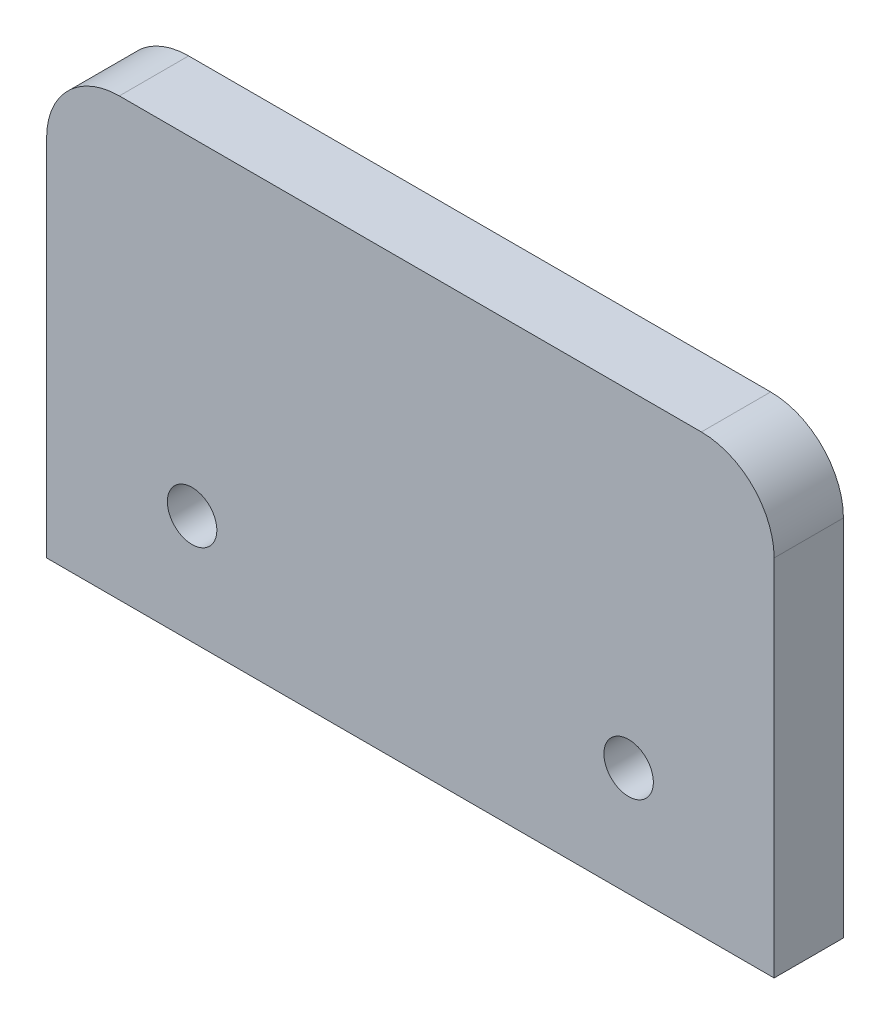
ISO-10303-21;
HEADER;
FILE_DESCRIPTION(('STEP AP214'),'2;1');
FILE_NAME('part.step','',(''),(''),'','','');
FILE_SCHEMA(('AUTOMOTIVE_DESIGN { 1 0 10303 214 1 1 1 1 }'));
ENDSEC;
DATA;
#1=APPLICATION_CONTEXT('core data for automotive mechanical design processes');
#2=APPLICATION_PROTOCOL_DEFINITION('international standard','automotive_design',2000,#1);
#3=PRODUCT_CONTEXT('',#1,'mechanical');
#4=PRODUCT('Part','Part','',(#3));
#5=PRODUCT_RELATED_PRODUCT_CATEGORY('part','',(#4));
#6=PRODUCT_DEFINITION_FORMATION('','',#4);
#7=PRODUCT_DEFINITION_CONTEXT('part definition',#1,'design');
#8=PRODUCT_DEFINITION('design','',#6,#7);
#9=PRODUCT_DEFINITION_SHAPE('','',#8);
#10=(LENGTH_UNIT() NAMED_UNIT(*) SI_UNIT(.MILLI.,.METRE.));
#11=(NAMED_UNIT(*) PLANE_ANGLE_UNIT() SI_UNIT($,.RADIAN.));
#12=(NAMED_UNIT(*) SI_UNIT($,.STERADIAN.) SOLID_ANGLE_UNIT());
#13=UNCERTAINTY_MEASURE_WITH_UNIT(LENGTH_MEASURE(1.E-05),#10,'distance_accuracy_value','');
#14=(GEOMETRIC_REPRESENTATION_CONTEXT(3) GLOBAL_UNCERTAINTY_ASSIGNED_CONTEXT((#13)) GLOBAL_UNIT_ASSIGNED_CONTEXT((#10,
#11,#12)) REPRESENTATION_CONTEXT('',''));
#15=CARTESIAN_POINT('',(0.,0.,0.));
#16=DIRECTION('',(0.,0.,1.));
#17=DIRECTION('',(1.,0.,0.));
#18=AXIS2_PLACEMENT_3D('',#15,#16,#17);
#19=CARTESIAN_POINT('',(-50.,-30.,9.525));
#20=DIRECTION('',(1.,0.,0.));
#21=DIRECTION('',(0.,0.,-1.));
#22=AXIS2_PLACEMENT_3D('',#19,#20,#21);
#23=PLANE('',#22);
#24=DIRECTION('',(0.,-1.,0.));
#25=VECTOR('',#24,1.);
#26=CARTESIAN_POINT('',(-50.,-30.,9.525));
#27=LINE('',#26,#25);
#28=CARTESIAN_POINT('',(-50.,20.,9.525));
#29=VERTEX_POINT('',#28);
#30=CARTESIAN_POINT('',(-50.,-30.,9.525));
#31=VERTEX_POINT('',#30);
#32=EDGE_CURVE('E144',#29,#31,#27,.T.);
#33=ORIENTED_EDGE('',*,*,#32,.F.);
#34=DIRECTION('',(0.,0.,-1.));
#35=VECTOR('',#34,1.);
#36=CARTESIAN_POINT('',(-50.,20.,9.525));
#37=LINE('',#36,#35);
#38=CARTESIAN_POINT('',(-50.,20.,0.));
#39=VERTEX_POINT('',#38);
#40=EDGE_CURVE('E175',#29,#39,#37,.T.);
#41=ORIENTED_EDGE('',*,*,#40,.T.);
#42=DIRECTION('',(0.,-1.,0.));
#43=VECTOR('',#42,1.);
#44=CARTESIAN_POINT('',(-50.,-30.,0.));
#45=LINE('',#44,#43);
#46=CARTESIAN_POINT('',(-50.,-30.,0.));
#47=VERTEX_POINT('',#46);
#48=EDGE_CURVE('E143',#39,#47,#45,.T.);
#49=ORIENTED_EDGE('',*,*,#48,.T.);
#50=DIRECTION('',(0.,0.,-1.));
#51=VECTOR('',#50,1.);
#52=CARTESIAN_POINT('',(-50.,-30.,9.525));
#53=LINE('',#52,#51);
#54=EDGE_CURVE('E171',#31,#47,#53,.T.);
#55=ORIENTED_EDGE('',*,*,#54,.F.);
#56=EDGE_LOOP('',(#33,#41,#49,#55));
#57=FACE_BOUND('',#56,.T.);
#58=ADVANCED_FACE('F56',(#57),#23,.F.);
#59=CARTESIAN_POINT('',(50.,-30.,9.525));
#60=DIRECTION('',(0.,1.,0.));
#61=DIRECTION('',(-1.,0.,0.));
#62=AXIS2_PLACEMENT_3D('',#59,#60,#61);
#63=PLANE('',#62);
#64=CARTESIAN_POINT('',(-20.,-30.,4.7625));
#65=DIRECTION('',(0.,-1.,0.));
#66=DIRECTION('',(0.,0.,-1.));
#67=AXIS2_PLACEMENT_3D('',#64,#65,#66);
#68=CIRCLE('',#67,2.5);
#69=CARTESIAN_POINT('',(-20.,-30.,2.2625));
#70=VERTEX_POINT('',#69);
#71=EDGE_CURVE('E128',#70,#70,#68,.T.);
#72=ORIENTED_EDGE('',*,*,#71,.F.);
#73=EDGE_LOOP('',(#72));
#74=FACE_BOUND('',#73,.T.);
#75=CARTESIAN_POINT('',(20.,-30.,4.7625));
#76=DIRECTION('',(0.,-1.,0.));
#77=DIRECTION('',(0.,0.,-1.));
#78=AXIS2_PLACEMENT_3D('',#75,#76,#77);
#79=CIRCLE('',#78,2.5);
#80=CARTESIAN_POINT('',(20.,-30.,2.2625));
#81=VERTEX_POINT('',#80);
#82=EDGE_CURVE('E127',#81,#81,#79,.T.);
#83=ORIENTED_EDGE('',*,*,#82,.F.);
#84=EDGE_LOOP('',(#83));
#85=FACE_BOUND('',#84,.T.);
#86=DIRECTION('',(1.,0.,0.));
#87=VECTOR('',#86,1.);
#88=CARTESIAN_POINT('',(50.,-30.,0.));
#89=LINE('',#88,#87);
#90=CARTESIAN_POINT('',(50.,-30.,0.));
#91=VERTEX_POINT('',#90);
#92=EDGE_CURVE('E160',#47,#91,#89,.T.);
#93=ORIENTED_EDGE('',*,*,#92,.T.);
#94=DIRECTION('',(0.,0.,-1.));
#95=VECTOR('',#94,1.);
#96=CARTESIAN_POINT('',(50.,-30.,9.525));
#97=LINE('',#96,#95);
#98=CARTESIAN_POINT('',(50.,-30.,9.525));
#99=VERTEX_POINT('',#98);
#100=EDGE_CURVE('E157',#99,#91,#97,.T.);
#101=ORIENTED_EDGE('',*,*,#100,.F.);
#102=DIRECTION('',(1.,0.,0.));
#103=VECTOR('',#102,1.);
#104=CARTESIAN_POINT('',(50.,-30.,9.525));
#105=LINE('',#104,#103);
#106=EDGE_CURVE('E147',#31,#99,#105,.T.);
#107=ORIENTED_EDGE('',*,*,#106,.F.);
#108=ORIENTED_EDGE('',*,*,#54,.T.);
#109=EDGE_LOOP('',(#93,#101,#107,#108));
#110=FACE_BOUND('',#109,.T.);
#111=ADVANCED_FACE('F217',(#74,#85,#110),#63,.F.);
#112=CARTESIAN_POINT('',(50.,-30.,9.525));
#113=DIRECTION('',(-1.,0.,0.));
#114=DIRECTION('',(0.,0.,1.));
#115=AXIS2_PLACEMENT_3D('',#112,#113,#114);
#116=PLANE('',#115);
#117=DIRECTION('',(0.,1.,0.));
#118=VECTOR('',#117,1.);
#119=CARTESIAN_POINT('',(50.,-30.,0.));
#120=LINE('',#119,#118);
#121=CARTESIAN_POINT('',(50.,20.,0.));
#122=VERTEX_POINT('',#121);
#123=EDGE_CURVE('E163',#91,#122,#120,.T.);
#124=ORIENTED_EDGE('',*,*,#123,.T.);
#125=DIRECTION('',(0.,0.,-1.));
#126=VECTOR('',#125,1.);
#127=CARTESIAN_POINT('',(50.,20.,9.525));
#128=LINE('',#127,#126);
#129=CARTESIAN_POINT('',(50.,20.,9.525));
#130=VERTEX_POINT('',#129);
#131=EDGE_CURVE('E13',#122,#130,#128,.F.);
#132=ORIENTED_EDGE('',*,*,#131,.T.);
#133=DIRECTION('',(0.,1.,0.));
#134=VECTOR('',#133,1.);
#135=CARTESIAN_POINT('',(50.,-30.,9.525));
#136=LINE('',#135,#134);
#137=EDGE_CURVE('E151',#99,#130,#136,.T.);
#138=ORIENTED_EDGE('',*,*,#137,.F.);
#139=ORIENTED_EDGE('',*,*,#100,.T.);
#140=EDGE_LOOP('',(#124,#132,#138,#139));
#141=FACE_BOUND('',#140,.T.);
#142=ADVANCED_FACE('F214',(#141),#116,.F.);
#143=CARTESIAN_POINT('',(50.,30.,9.525));
#144=DIRECTION('',(0.,-1.,0.));
#145=DIRECTION('',(1.,0.,0.));
#146=AXIS2_PLACEMENT_3D('',#143,#144,#145);
#147=PLANE('',#146);
#148=DIRECTION('',(-1.,0.,0.));
#149=VECTOR('',#148,1.);
#150=CARTESIAN_POINT('',(50.,30.,0.));
#151=LINE('',#150,#149);
#152=CARTESIAN_POINT('',(40.,30.,0.));
#153=VERTEX_POINT('',#152);
#154=CARTESIAN_POINT('',(-40.,30.,0.));
#155=VERTEX_POINT('',#154);
#156=EDGE_CURVE('E148',#153,#155,#151,.T.);
#157=ORIENTED_EDGE('',*,*,#156,.T.);
#158=DIRECTION('',(0.,0.,-1.));
#159=VECTOR('',#158,1.);
#160=CARTESIAN_POINT('',(-40.,30.,9.525));
#161=LINE('',#160,#159);
#162=CARTESIAN_POINT('',(-40.,30.,9.525));
#163=VERTEX_POINT('',#162);
#164=EDGE_CURVE('E78',#155,#163,#161,.F.);
#165=ORIENTED_EDGE('',*,*,#164,.T.);
#166=DIRECTION('',(-1.,0.,0.));
#167=VECTOR('',#166,1.);
#168=CARTESIAN_POINT('',(50.,30.,9.525));
#169=LINE('',#168,#167);
#170=CARTESIAN_POINT('',(40.,30.,9.525));
#171=VERTEX_POINT('',#170);
#172=EDGE_CURVE('E154',#171,#163,#169,.T.);
#173=ORIENTED_EDGE('',*,*,#172,.F.);
#174=DIRECTION('',(0.,0.,-1.));
#175=VECTOR('',#174,1.);
#176=CARTESIAN_POINT('',(40.,30.,9.525));
#177=LINE('',#176,#175);
#178=EDGE_CURVE('E185',#171,#153,#177,.T.);
#179=ORIENTED_EDGE('',*,*,#178,.T.);
#180=EDGE_LOOP('',(#157,#165,#173,#179));
#181=FACE_BOUND('',#180,.T.);
#182=ADVANCED_FACE('F209',(#181),#147,.F.);
#183=CARTESIAN_POINT('',(0.,0.,9.525));
#184=DIRECTION('',(0.,0.,1.));
#185=DIRECTION('',(1.,0.,0.));
#186=AXIS2_PLACEMENT_3D('',#183,#184,#185);
#187=PLANE('',#186);
#188=CARTESIAN_POINT('',(30.,-15.,9.525));
#189=DIRECTION('',(0.,0.,-1.));
#190=DIRECTION('',(-1.,0.,0.));
#191=AXIS2_PLACEMENT_3D('',#188,#189,#190);
#192=CIRCLE('',#191,3.39999999999999);
#193=CARTESIAN_POINT('',(26.6,-15.,9.525));
#194=VERTEX_POINT('',#193);
#195=EDGE_CURVE('E388',#194,#194,#192,.T.);
#196=ORIENTED_EDGE('',*,*,#195,.T.);
#197=EDGE_LOOP('',(#196));
#198=FACE_BOUND('',#197,.T.);
#199=CARTESIAN_POINT('',(-30.,-15.,9.525));
#200=DIRECTION('',(0.,0.,-1.));
#201=DIRECTION('',(-1.,0.,0.));
#202=AXIS2_PLACEMENT_3D('',#199,#200,#201);
#203=CIRCLE('',#202,3.4);
#204=CARTESIAN_POINT('',(-33.4,-15.,9.525));
#205=VERTEX_POINT('',#204);
#206=EDGE_CURVE('E136',#205,#205,#203,.T.);
#207=ORIENTED_EDGE('',*,*,#206,.T.);
#208=EDGE_LOOP('',(#207));
#209=FACE_BOUND('',#208,.T.);
#210=ORIENTED_EDGE('',*,*,#172,.T.);
#211=CARTESIAN_POINT('',(-40.,20.,9.525));
#212=DIRECTION('',(0.,0.,1.));
#213=DIRECTION('',(1.,0.,0.));
#214=AXIS2_PLACEMENT_3D('',#211,#212,#213);
#215=CIRCLE('',#214,10.);
#216=EDGE_CURVE('E65',#163,#29,#215,.T.);
#217=ORIENTED_EDGE('',*,*,#216,.T.);
#218=ORIENTED_EDGE('',*,*,#32,.T.);
#219=ORIENTED_EDGE('',*,*,#106,.T.);
#220=ORIENTED_EDGE('',*,*,#137,.T.);
#221=CARTESIAN_POINT('',(40.,20.,9.525));
#222=DIRECTION('',(0.,0.,1.));
#223=DIRECTION('',(1.,0.,0.));
#224=AXIS2_PLACEMENT_3D('',#221,#222,#223);
#225=CIRCLE('',#224,10.);
#226=EDGE_CURVE('E191',#130,#171,#225,.T.);
#227=ORIENTED_EDGE('',*,*,#226,.T.);
#228=EDGE_LOOP('',(#210,#217,#218,#219,#220,#227));
#229=FACE_BOUND('',#228,.T.);
#230=ADVANCED_FACE('F197',(#198,#209,#229),#187,.T.);
#231=CARTESIAN_POINT('',(0.,0.,0.));
#232=DIRECTION('',(0.,0.,1.));
#233=DIRECTION('',(1.,0.,0.));
#234=AXIS2_PLACEMENT_3D('',#231,#232,#233);
#235=PLANE('',#234);
#236=CARTESIAN_POINT('',(30.,-15.,0.));
#237=DIRECTION('',(0.,0.,-1.));
#238=DIRECTION('',(-1.,0.,0.));
#239=AXIS2_PLACEMENT_3D('',#236,#237,#238);
#240=CIRCLE('',#239,3.39999999999999);
#241=CARTESIAN_POINT('',(26.6,-15.,0.));
#242=VERTEX_POINT('',#241);
#243=EDGE_CURVE('E390',#242,#242,#240,.T.);
#244=ORIENTED_EDGE('',*,*,#243,.F.);
#245=EDGE_LOOP('',(#244));
#246=FACE_BOUND('',#245,.T.);
#247=CARTESIAN_POINT('',(-30.,-15.,0.));
#248=DIRECTION('',(0.,0.,-1.));
#249=DIRECTION('',(-1.,0.,0.));
#250=AXIS2_PLACEMENT_3D('',#247,#248,#249);
#251=CIRCLE('',#250,3.39999999999999);
#252=CARTESIAN_POINT('',(-33.4,-15.,0.));
#253=VERTEX_POINT('',#252);
#254=EDGE_CURVE('E394',#253,#253,#251,.T.);
#255=ORIENTED_EDGE('',*,*,#254,.F.);
#256=EDGE_LOOP('',(#255));
#257=FACE_BOUND('',#256,.T.);
#258=ORIENTED_EDGE('',*,*,#48,.F.);
#259=CARTESIAN_POINT('',(-40.,20.,0.));
#260=DIRECTION('',(0.,0.,1.));
#261=DIRECTION('',(1.,0.,0.));
#262=AXIS2_PLACEMENT_3D('',#259,#260,#261);
#263=CIRCLE('',#262,10.);
#264=EDGE_CURVE('E182',#39,#155,#263,.F.);
#265=ORIENTED_EDGE('',*,*,#264,.T.);
#266=ORIENTED_EDGE('',*,*,#156,.F.);
#267=CARTESIAN_POINT('',(40.,20.,0.));
#268=DIRECTION('',(0.,0.,1.));
#269=DIRECTION('',(1.,0.,0.));
#270=AXIS2_PLACEMENT_3D('',#267,#268,#269);
#271=CIRCLE('',#270,10.);
#272=EDGE_CURVE('E179',#153,#122,#271,.F.);
#273=ORIENTED_EDGE('',*,*,#272,.T.);
#274=ORIENTED_EDGE('',*,*,#123,.F.);
#275=ORIENTED_EDGE('',*,*,#92,.F.);
#276=EDGE_LOOP('',(#258,#265,#266,#273,#274,#275));
#277=FACE_BOUND('',#276,.T.);
#278=ADVANCED_FACE('F207',(#246,#257,#277),#235,.F.);
#279=CARTESIAN_POINT('',(-40.,20.,9.525));
#280=DIRECTION('',(0.,0.,-1.));
#281=DIRECTION('',(-1.,0.,0.));
#282=AXIS2_PLACEMENT_3D('',#279,#280,#281);
#283=CYLINDRICAL_SURFACE('',#282,10.);
#284=ORIENTED_EDGE('',*,*,#216,.F.);
#285=ORIENTED_EDGE('',*,*,#164,.F.);
#286=ORIENTED_EDGE('',*,*,#264,.F.);
#287=ORIENTED_EDGE('',*,*,#40,.F.);
#288=EDGE_LOOP('',(#284,#285,#286,#287));
#289=FACE_BOUND('',#288,.T.);
#290=ADVANCED_FACE('F204',(#289),#283,.T.);
#291=CARTESIAN_POINT('',(40.,20.,9.525));
#292=DIRECTION('',(0.,0.,-1.));
#293=DIRECTION('',(-1.,0.,0.));
#294=AXIS2_PLACEMENT_3D('',#291,#292,#293);
#295=CYLINDRICAL_SURFACE('',#294,10.);
#296=ORIENTED_EDGE('',*,*,#226,.F.);
#297=ORIENTED_EDGE('',*,*,#131,.F.);
#298=ORIENTED_EDGE('',*,*,#272,.F.);
#299=ORIENTED_EDGE('',*,*,#178,.F.);
#300=EDGE_LOOP('',(#296,#297,#298,#299));
#301=FACE_BOUND('',#300,.T.);
#302=ADVANCED_FACE('F58',(#301),#295,.T.);
#303=CARTESIAN_POINT('',(20.,-15.,4.7625));
#304=DIRECTION('',(0.,-1.,0.));
#305=DIRECTION('',(0.,0.,-1.));
#306=AXIS2_PLACEMENT_3D('',#303,#304,#305);
#307=CONICAL_SURFACE('',#306,2.5,1.02974425867665);
#308=CARTESIAN_POINT('',(20.,-13.4978484524311,4.7625));
#309=VERTEX_POINT('',#308);
#310=VERTEX_LOOP('',#309);
#311=FACE_BOUND('',#310,.T.);
#312=CARTESIAN_POINT('',(20.,-15.,4.7625));
#313=DIRECTION('',(0.,-1.,0.));
#314=DIRECTION('',(0.,0.,-1.));
#315=AXIS2_PLACEMENT_3D('',#312,#313,#314);
#316=CIRCLE('',#315,2.5);
#317=CARTESIAN_POINT('',(20.,-15.,2.2625));
#318=VERTEX_POINT('',#317);
#319=EDGE_CURVE('E133',#318,#318,#316,.T.);
#320=ORIENTED_EDGE('',*,*,#319,.T.);
#321=EDGE_LOOP('',(#320));
#322=FACE_BOUND('',#321,.T.);
#323=ADVANCED_FACE('F235',(#311,#322),#307,.F.);
#324=CARTESIAN_POINT('',(20.,-30.,4.7625));
#325=DIRECTION('',(0.,-1.,0.));
#326=DIRECTION('',(0.,0.,-1.));
#327=AXIS2_PLACEMENT_3D('',#324,#325,#326);
#328=CYLINDRICAL_SURFACE('',#327,2.5);
#329=ORIENTED_EDGE('',*,*,#319,.F.);
#330=EDGE_LOOP('',(#329));
#331=FACE_BOUND('',#330,.T.);
#332=ORIENTED_EDGE('',*,*,#82,.T.);
#333=EDGE_LOOP('',(#332));
#334=FACE_BOUND('',#333,.T.);
#335=ADVANCED_FACE('F120',(#331,#334),#328,.F.);
#336=CARTESIAN_POINT('',(-20.,-15.,4.7625));
#337=DIRECTION('',(0.,-1.,0.));
#338=DIRECTION('',(0.,0.,-1.));
#339=AXIS2_PLACEMENT_3D('',#336,#337,#338);
#340=CONICAL_SURFACE('',#339,2.5,1.02974425867665);
#341=CARTESIAN_POINT('',(-20.,-13.4978484524311,4.7625));
#342=VERTEX_POINT('',#341);
#343=VERTEX_LOOP('',#342);
#344=FACE_BOUND('',#343,.T.);
#345=CARTESIAN_POINT('',(-20.,-15.,4.7625));
#346=DIRECTION('',(0.,-1.,0.));
#347=DIRECTION('',(0.,0.,-1.));
#348=AXIS2_PLACEMENT_3D('',#345,#346,#347);
#349=CIRCLE('',#348,2.5);
#350=CARTESIAN_POINT('',(-20.,-15.,2.2625));
#351=VERTEX_POINT('',#350);
#352=EDGE_CURVE('E124',#351,#351,#349,.T.);
#353=ORIENTED_EDGE('',*,*,#352,.T.);
#354=EDGE_LOOP('',(#353));
#355=FACE_BOUND('',#354,.T.);
#356=ADVANCED_FACE('F116',(#344,#355),#340,.F.);
#357=CARTESIAN_POINT('',(-20.,-30.,4.7625));
#358=DIRECTION('',(0.,-1.,0.));
#359=DIRECTION('',(0.,0.,-1.));
#360=AXIS2_PLACEMENT_3D('',#357,#358,#359);
#361=CYLINDRICAL_SURFACE('',#360,2.5);
#362=ORIENTED_EDGE('',*,*,#352,.F.);
#363=EDGE_LOOP('',(#362));
#364=FACE_BOUND('',#363,.T.);
#365=ORIENTED_EDGE('',*,*,#71,.T.);
#366=EDGE_LOOP('',(#365));
#367=FACE_BOUND('',#366,.T.);
#368=ADVANCED_FACE('F119',(#364,#367),#361,.F.);
#369=CARTESIAN_POINT('',(-30.,-15.,0.));
#370=DIRECTION('',(0.,0.,-1.));
#371=DIRECTION('',(-1.,0.,0.));
#372=AXIS2_PLACEMENT_3D('',#369,#370,#371);
#373=CYLINDRICAL_SURFACE('',#372,3.39999999999999);
#374=ORIENTED_EDGE('',*,*,#206,.F.);
#375=EDGE_LOOP('',(#374));
#376=FACE_BOUND('',#375,.T.);
#377=ORIENTED_EDGE('',*,*,#254,.T.);
#378=EDGE_LOOP('',(#377));
#379=FACE_BOUND('',#378,.T.);
#380=ADVANCED_FACE('F275',(#376,#379),#373,.F.);
#381=CARTESIAN_POINT('',(30.,-15.,0.));
#382=DIRECTION('',(0.,0.,-1.));
#383=DIRECTION('',(-1.,0.,0.));
#384=AXIS2_PLACEMENT_3D('',#381,#382,#383);
#385=CYLINDRICAL_SURFACE('',#384,3.39999999999999);
#386=ORIENTED_EDGE('',*,*,#195,.F.);
#387=EDGE_LOOP('',(#386));
#388=FACE_BOUND('',#387,.T.);
#389=ORIENTED_EDGE('',*,*,#243,.T.);
#390=EDGE_LOOP('',(#389));
#391=FACE_BOUND('',#390,.T.);
#392=ADVANCED_FACE('F281',(#388,#391),#385,.F.);
#393=CLOSED_SHELL('',(#58,#111,#142,#182,#230,#278,#290,#302,#323,#335,#356,#368,#380,#392));
#394=MANIFOLD_SOLID_BREP('B2',#393);
#395=ADVANCED_BREP_SHAPE_REPRESENTATION('',(#18,#394),#14);
#396=SHAPE_DEFINITION_REPRESENTATION(#9,#395);
ENDSEC;
END-ISO-10303-21;
